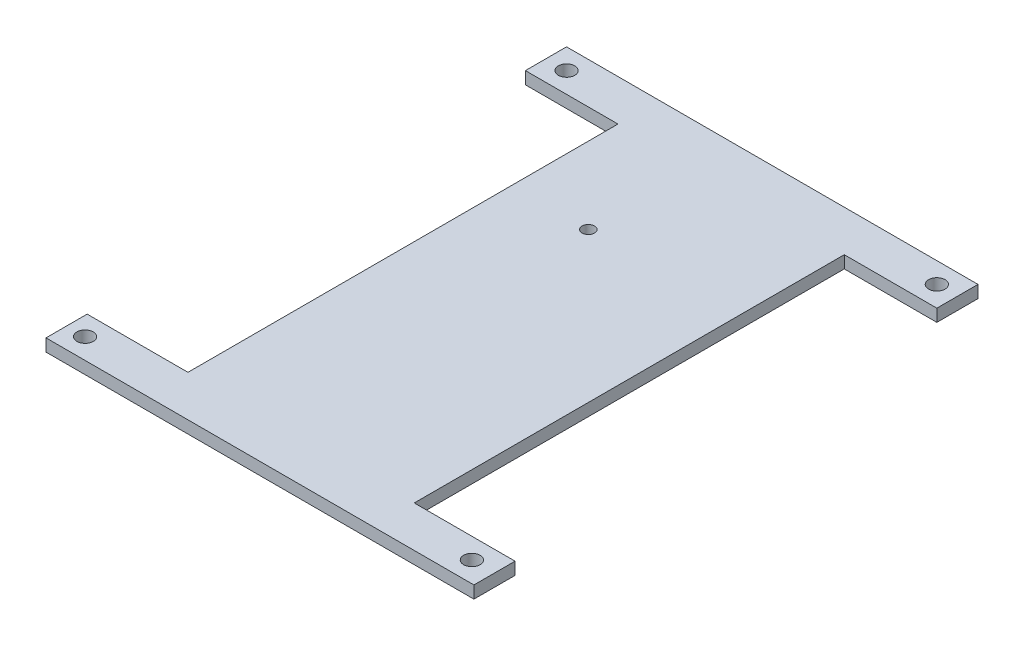
ISO-10303-21;
HEADER;
FILE_DESCRIPTION(('STEP AP214'),'2;1');
FILE_NAME('part.step','',(''),(''),'','','');
FILE_SCHEMA(('AUTOMOTIVE_DESIGN { 1 0 10303 214 1 1 1 1 }'));
ENDSEC;
DATA;
#1=APPLICATION_CONTEXT('core data for automotive mechanical design processes');
#2=APPLICATION_PROTOCOL_DEFINITION('international standard','automotive_design',2000,#1);
#3=PRODUCT_CONTEXT('',#1,'mechanical');
#4=PRODUCT('Part','Part','',(#3));
#5=PRODUCT_RELATED_PRODUCT_CATEGORY('part','',(#4));
#6=PRODUCT_DEFINITION_FORMATION('','',#4);
#7=PRODUCT_DEFINITION_CONTEXT('part definition',#1,'design');
#8=PRODUCT_DEFINITION('design','',#6,#7);
#9=PRODUCT_DEFINITION_SHAPE('','',#8);
#10=(LENGTH_UNIT() NAMED_UNIT(*) SI_UNIT(.MILLI.,.METRE.));
#11=(NAMED_UNIT(*) PLANE_ANGLE_UNIT() SI_UNIT($,.RADIAN.));
#12=(NAMED_UNIT(*) SI_UNIT($,.STERADIAN.) SOLID_ANGLE_UNIT());
#13=UNCERTAINTY_MEASURE_WITH_UNIT(LENGTH_MEASURE(1.E-05),#10,'distance_accuracy_value','');
#14=(GEOMETRIC_REPRESENTATION_CONTEXT(3) GLOBAL_UNCERTAINTY_ASSIGNED_CONTEXT((#13)) GLOBAL_UNIT_ASSIGNED_CONTEXT((#10,
#11,#12)) REPRESENTATION_CONTEXT('',''));
#15=CARTESIAN_POINT('',(0.,0.,0.));
#16=DIRECTION('',(0.,0.,1.));
#17=DIRECTION('',(1.,0.,0.));
#18=AXIS2_PLACEMENT_3D('',#15,#16,#17);
#19=CARTESIAN_POINT('',(0.,0.,0.));
#20=DIRECTION('',(0.,1.,0.));
#21=DIRECTION('',(0.,0.,1.));
#22=AXIS2_PLACEMENT_3D('',#19,#20,#21);
#23=PLANE('',#22);
#24=CARTESIAN_POINT('',(-8.90000000000001,0.,-29.2));
#25=DIRECTION('',(0.,1.,0.));
#26=DIRECTION('',(0.,0.,1.));
#27=AXIS2_PLACEMENT_3D('',#24,#25,#26);
#28=CIRCLE('',#27,1.5);
#29=CARTESIAN_POINT('',(-8.90000000000001,0.,-27.7));
#30=VERTEX_POINT('',#29);
#31=EDGE_CURVE('E198',#30,#30,#28,.T.);
#32=ORIENTED_EDGE('',*,*,#31,.T.);
#33=EDGE_LOOP('',(#32));
#34=FACE_BOUND('',#33,.T.);
#35=DIRECTION('',(0.,0.,-1.));
#36=VECTOR('',#35,1.);
#37=CARTESIAN_POINT('',(-27.5,0.,0.));
#38=LINE('',#37,#36);
#39=CARTESIAN_POINT('',(-27.5,0.,49.51));
#40=VERTEX_POINT('',#39);
#41=CARTESIAN_POINT('',(-27.5,0.,-55.));
#42=VERTEX_POINT('',#41);
#43=EDGE_CURVE('E335',#40,#42,#38,.T.);
#44=ORIENTED_EDGE('',*,*,#43,.T.);
#45=DIRECTION('',(1.,0.,0.));
#46=VECTOR('',#45,1.);
#47=CARTESIAN_POINT('',(-50.,0.,-55.));
#48=LINE('',#47,#46);
#49=CARTESIAN_POINT('',(-50.,0.,-55.));
#50=VERTEX_POINT('',#49);
#51=EDGE_CURVE('E322',#50,#42,#48,.T.);
#52=ORIENTED_EDGE('',*,*,#51,.F.);
#53=DIRECTION('',(0.,0.,1.));
#54=VECTOR('',#53,1.);
#55=CARTESIAN_POINT('',(-50.,0.,-55.));
#56=LINE('',#55,#54);
#57=CARTESIAN_POINT('',(-50.,0.,-65.));
#58=VERTEX_POINT('',#57);
#59=EDGE_CURVE('E295',#58,#50,#56,.T.);
#60=ORIENTED_EDGE('',*,*,#59,.F.);
#61=DIRECTION('',(-1.,0.,0.));
#62=VECTOR('',#61,1.);
#63=CARTESIAN_POINT('',(-50.,0.,-65.));
#64=LINE('',#63,#62);
#65=CARTESIAN_POINT('',(50.,0.,-65.));
#66=VERTEX_POINT('',#65);
#67=EDGE_CURVE('E311',#66,#58,#64,.T.);
#68=ORIENTED_EDGE('',*,*,#67,.F.);
#69=DIRECTION('',(0.,0.,-1.));
#70=VECTOR('',#69,1.);
#71=CARTESIAN_POINT('',(50.,0.,-55.));
#72=LINE('',#71,#70);
#73=CARTESIAN_POINT('',(50.,0.,-55.));
#74=VERTEX_POINT('',#73);
#75=EDGE_CURVE('E319',#74,#66,#72,.T.);
#76=ORIENTED_EDGE('',*,*,#75,.F.);
#77=CARTESIAN_POINT('',(27.5,0.,-55.));
#78=VERTEX_POINT('',#77);
#79=EDGE_CURVE('E297',#78,#74,#48,.T.);
#80=ORIENTED_EDGE('',*,*,#79,.F.);
#81=DIRECTION('',(0.,0.,-1.));
#82=VECTOR('',#81,1.);
#83=CARTESIAN_POINT('',(27.5,0.,0.));
#84=LINE('',#83,#82);
#85=CARTESIAN_POINT('',(27.5,0.,49.51));
#86=VERTEX_POINT('',#85);
#87=EDGE_CURVE('E337',#86,#78,#84,.T.);
#88=ORIENTED_EDGE('',*,*,#87,.F.);
#89=DIRECTION('',(-1.,0.,0.));
#90=VECTOR('',#89,1.);
#91=CARTESIAN_POINT('',(-52.,0.,49.51));
#92=LINE('',#91,#90);
#93=CARTESIAN_POINT('',(52.,0.,49.51));
#94=VERTEX_POINT('',#93);
#95=EDGE_CURVE('E132',#94,#86,#92,.T.);
#96=ORIENTED_EDGE('',*,*,#95,.F.);
#97=DIRECTION('',(0.,0.,-1.));
#98=VECTOR('',#97,1.);
#99=CARTESIAN_POINT('',(52.,0.,59.51));
#100=LINE('',#99,#98);
#101=CARTESIAN_POINT('',(52.,0.,59.51));
#102=VERTEX_POINT('',#101);
#103=EDGE_CURVE('E143',#102,#94,#100,.T.);
#104=ORIENTED_EDGE('',*,*,#103,.F.);
#105=DIRECTION('',(1.,0.,0.));
#106=VECTOR('',#105,1.);
#107=CARTESIAN_POINT('',(-52.,0.,59.51));
#108=LINE('',#107,#106);
#109=CARTESIAN_POINT('',(-52.,0.,59.51));
#110=VERTEX_POINT('',#109);
#111=EDGE_CURVE('E124',#110,#102,#108,.T.);
#112=ORIENTED_EDGE('',*,*,#111,.F.);
#113=DIRECTION('',(0.,0.,1.));
#114=VECTOR('',#113,1.);
#115=CARTESIAN_POINT('',(-52.,0.,59.51));
#116=LINE('',#115,#114);
#117=CARTESIAN_POINT('',(-52.,0.,49.51));
#118=VERTEX_POINT('',#117);
#119=EDGE_CURVE('E140',#118,#110,#116,.T.);
#120=ORIENTED_EDGE('',*,*,#119,.F.);
#121=EDGE_CURVE('E159',#40,#118,#92,.T.);
#122=ORIENTED_EDGE('',*,*,#121,.F.);
#123=EDGE_LOOP('',(#44,#52,#60,#68,#76,#80,#88,#96,#104,#112,#120,#122));
#124=FACE_BOUND('',#123,.T.);
#125=CARTESIAN_POINT('',(45.,0.,-60.));
#126=DIRECTION('',(0.,1.,0.));
#127=DIRECTION('',(0.,0.,1.));
#128=AXIS2_PLACEMENT_3D('',#125,#126,#127);
#129=CIRCLE('',#128,2.);
#130=CARTESIAN_POINT('',(45.,0.,-58.));
#131=VERTEX_POINT('',#130);
#132=EDGE_CURVE('E495',#131,#131,#129,.T.);
#133=ORIENTED_EDGE('',*,*,#132,.T.);
#134=EDGE_LOOP('',(#133));
#135=FACE_BOUND('',#134,.T.);
#136=CARTESIAN_POINT('',(-45.,0.,-60.));
#137=DIRECTION('',(0.,1.,0.));
#138=DIRECTION('',(0.,0.,1.));
#139=AXIS2_PLACEMENT_3D('',#136,#137,#138);
#140=CIRCLE('',#139,2.);
#141=CARTESIAN_POINT('',(-45.,0.,-58.));
#142=VERTEX_POINT('',#141);
#143=EDGE_CURVE('E288',#142,#142,#140,.T.);
#144=ORIENTED_EDGE('',*,*,#143,.T.);
#145=EDGE_LOOP('',(#144));
#146=FACE_BOUND('',#145,.T.);
#147=CARTESIAN_POINT('',(46.5,0.,54.51));
#148=DIRECTION('',(0.,1.,0.));
#149=DIRECTION('',(0.,0.,1.));
#150=AXIS2_PLACEMENT_3D('',#147,#148,#149);
#151=CIRCLE('',#150,2.);
#152=CARTESIAN_POINT('',(46.5,0.,56.51));
#153=VERTEX_POINT('',#152);
#154=EDGE_CURVE('E193',#153,#153,#151,.T.);
#155=ORIENTED_EDGE('',*,*,#154,.T.);
#156=EDGE_LOOP('',(#155));
#157=FACE_BOUND('',#156,.T.);
#158=CARTESIAN_POINT('',(-47.5,0.,54.51));
#159=DIRECTION('',(0.,1.,0.));
#160=DIRECTION('',(0.,0.,1.));
#161=AXIS2_PLACEMENT_3D('',#158,#159,#160);
#162=CIRCLE('',#161,2.);
#163=CARTESIAN_POINT('',(-47.5,0.,56.51));
#164=VERTEX_POINT('',#163);
#165=EDGE_CURVE('E188',#164,#164,#162,.T.);
#166=ORIENTED_EDGE('',*,*,#165,.T.);
#167=EDGE_LOOP('',(#166));
#168=FACE_BOUND('',#167,.T.);
#169=ADVANCED_FACE('F32',(#34,#124,#135,#146,#157,#168),#23,.F.);
#170=CARTESIAN_POINT('',(-27.5,0.,0.));
#171=DIRECTION('',(1.,0.,0.));
#172=DIRECTION('',(0.,0.,-1.));
#173=AXIS2_PLACEMENT_3D('',#170,#171,#172);
#174=PLANE('',#173);
#175=DIRECTION('',(0.,0.,-1.));
#176=VECTOR('',#175,1.);
#177=CARTESIAN_POINT('',(-27.5,3.,0.));
#178=LINE('',#177,#176);
#179=CARTESIAN_POINT('',(-27.5,3.,49.51));
#180=VERTEX_POINT('',#179);
#181=CARTESIAN_POINT('',(-27.5,3.,-55.));
#182=VERTEX_POINT('',#181);
#183=EDGE_CURVE('E340',#180,#182,#178,.T.);
#184=ORIENTED_EDGE('',*,*,#183,.T.);
#185=DIRECTION('',(0.,1.,0.));
#186=VECTOR('',#185,1.);
#187=CARTESIAN_POINT('',(-27.5,0.,-55.));
#188=LINE('',#187,#186);
#189=EDGE_CURVE('E11',#42,#182,#188,.T.);
#190=ORIENTED_EDGE('',*,*,#189,.F.);
#191=ORIENTED_EDGE('',*,*,#43,.F.);
#192=DIRECTION('',(0.,1.,0.));
#193=VECTOR('',#192,1.);
#194=CARTESIAN_POINT('',(-27.5,0.,49.51));
#195=LINE('',#194,#193);
#196=EDGE_CURVE('E35',#40,#180,#195,.T.);
#197=ORIENTED_EDGE('',*,*,#196,.T.);
#198=EDGE_LOOP('',(#184,#190,#191,#197));
#199=FACE_BOUND('',#198,.T.);
#200=ADVANCED_FACE('F221',(#199),#174,.F.);
#201=CARTESIAN_POINT('',(27.5,0.,0.));
#202=DIRECTION('',(1.,0.,0.));
#203=DIRECTION('',(0.,0.,-1.));
#204=AXIS2_PLACEMENT_3D('',#201,#202,#203);
#205=PLANE('',#204);
#206=DIRECTION('',(0.,0.,-1.));
#207=VECTOR('',#206,1.);
#208=CARTESIAN_POINT('',(27.5,3.,0.));
#209=LINE('',#208,#207);
#210=CARTESIAN_POINT('',(27.5,3.,49.51));
#211=VERTEX_POINT('',#210);
#212=CARTESIAN_POINT('',(27.5,3.,-55.));
#213=VERTEX_POINT('',#212);
#214=EDGE_CURVE('E304',#211,#213,#209,.T.);
#215=ORIENTED_EDGE('',*,*,#214,.F.);
#216=DIRECTION('',(0.,1.,0.));
#217=VECTOR('',#216,1.);
#218=CARTESIAN_POINT('',(27.5,0.,49.51));
#219=LINE('',#218,#217);
#220=EDGE_CURVE('E53',#86,#211,#219,.T.);
#221=ORIENTED_EDGE('',*,*,#220,.F.);
#222=ORIENTED_EDGE('',*,*,#87,.T.);
#223=DIRECTION('',(0.,1.,0.));
#224=VECTOR('',#223,1.);
#225=CARTESIAN_POINT('',(27.5,0.,-55.));
#226=LINE('',#225,#224);
#227=EDGE_CURVE('E48',#78,#213,#226,.T.);
#228=ORIENTED_EDGE('',*,*,#227,.T.);
#229=EDGE_LOOP('',(#215,#221,#222,#228));
#230=FACE_BOUND('',#229,.T.);
#231=ADVANCED_FACE('F212',(#230),#205,.T.);
#232=CARTESIAN_POINT('',(0.,3.,0.));
#233=DIRECTION('',(0.,1.,0.));
#234=DIRECTION('',(0.,0.,1.));
#235=AXIS2_PLACEMENT_3D('',#232,#233,#234);
#236=PLANE('',#235);
#237=CARTESIAN_POINT('',(-8.90000000000001,3.,-29.2));
#238=DIRECTION('',(0.,1.,0.));
#239=DIRECTION('',(0.,0.,1.));
#240=AXIS2_PLACEMENT_3D('',#237,#238,#239);
#241=CIRCLE('',#240,1.5);
#242=CARTESIAN_POINT('',(-8.90000000000001,3.,-27.7));
#243=VERTEX_POINT('',#242);
#244=EDGE_CURVE('E203',#243,#243,#241,.T.);
#245=ORIENTED_EDGE('',*,*,#244,.F.);
#246=EDGE_LOOP('',(#245));
#247=FACE_BOUND('',#246,.T.);
#248=ORIENTED_EDGE('',*,*,#214,.T.);
#249=DIRECTION('',(1.,0.,0.));
#250=VECTOR('',#249,1.);
#251=CARTESIAN_POINT('',(-50.,3.,-55.));
#252=LINE('',#251,#250);
#253=CARTESIAN_POINT('',(50.,3.,-55.));
#254=VERTEX_POINT('',#253);
#255=EDGE_CURVE('E287',#213,#254,#252,.T.);
#256=ORIENTED_EDGE('',*,*,#255,.T.);
#257=DIRECTION('',(0.,0.,-1.));
#258=VECTOR('',#257,1.);
#259=CARTESIAN_POINT('',(50.,3.,-55.));
#260=LINE('',#259,#258);
#261=CARTESIAN_POINT('',(50.,3.,-65.));
#262=VERTEX_POINT('',#261);
#263=EDGE_CURVE('E294',#254,#262,#260,.T.);
#264=ORIENTED_EDGE('',*,*,#263,.T.);
#265=DIRECTION('',(-1.,0.,0.));
#266=VECTOR('',#265,1.);
#267=CARTESIAN_POINT('',(-50.,3.,-65.));
#268=LINE('',#267,#266);
#269=CARTESIAN_POINT('',(-50.,3.,-65.));
#270=VERTEX_POINT('',#269);
#271=EDGE_CURVE('E292',#262,#270,#268,.T.);
#272=ORIENTED_EDGE('',*,*,#271,.T.);
#273=DIRECTION('',(0.,0.,1.));
#274=VECTOR('',#273,1.);
#275=CARTESIAN_POINT('',(-50.,3.,-55.));
#276=LINE('',#275,#274);
#277=CARTESIAN_POINT('',(-50.,3.,-55.));
#278=VERTEX_POINT('',#277);
#279=EDGE_CURVE('E279',#270,#278,#276,.T.);
#280=ORIENTED_EDGE('',*,*,#279,.T.);
#281=EDGE_CURVE('E299',#278,#182,#252,.T.);
#282=ORIENTED_EDGE('',*,*,#281,.T.);
#283=ORIENTED_EDGE('',*,*,#183,.F.);
#284=DIRECTION('',(-1.,0.,0.));
#285=VECTOR('',#284,1.);
#286=CARTESIAN_POINT('',(-52.,3.,49.51));
#287=LINE('',#286,#285);
#288=CARTESIAN_POINT('',(-52.,3.,49.51));
#289=VERTEX_POINT('',#288);
#290=EDGE_CURVE('E152',#180,#289,#287,.T.);
#291=ORIENTED_EDGE('',*,*,#290,.T.);
#292=DIRECTION('',(0.,0.,1.));
#293=VECTOR('',#292,1.);
#294=CARTESIAN_POINT('',(-52.,3.,59.51));
#295=LINE('',#294,#293);
#296=CARTESIAN_POINT('',(-52.,3.,59.51));
#297=VERTEX_POINT('',#296);
#298=EDGE_CURVE('E162',#289,#297,#295,.T.);
#299=ORIENTED_EDGE('',*,*,#298,.T.);
#300=DIRECTION('',(1.,0.,0.));
#301=VECTOR('',#300,1.);
#302=CARTESIAN_POINT('',(-52.,3.,59.51));
#303=LINE('',#302,#301);
#304=CARTESIAN_POINT('',(52.,3.,59.51));
#305=VERTEX_POINT('',#304);
#306=EDGE_CURVE('E126',#297,#305,#303,.T.);
#307=ORIENTED_EDGE('',*,*,#306,.T.);
#308=DIRECTION('',(0.,0.,-1.));
#309=VECTOR('',#308,1.);
#310=CARTESIAN_POINT('',(52.,3.,59.51));
#311=LINE('',#310,#309);
#312=CARTESIAN_POINT('',(52.,3.,49.51));
#313=VERTEX_POINT('',#312);
#314=EDGE_CURVE('E171',#305,#313,#311,.T.);
#315=ORIENTED_EDGE('',*,*,#314,.T.);
#316=EDGE_CURVE('E149',#313,#211,#287,.T.);
#317=ORIENTED_EDGE('',*,*,#316,.T.);
#318=EDGE_LOOP('',(#248,#256,#264,#272,#280,#282,#283,#291,#299,#307,#315,#317));
#319=FACE_BOUND('',#318,.T.);
#320=CARTESIAN_POINT('',(45.,3.,-60.));
#321=DIRECTION('',(0.,1.,0.));
#322=DIRECTION('',(0.,0.,1.));
#323=AXIS2_PLACEMENT_3D('',#320,#321,#322);
#324=CIRCLE('',#323,2.);
#325=CARTESIAN_POINT('',(45.,3.,-58.));
#326=VERTEX_POINT('',#325);
#327=EDGE_CURVE('E177',#326,#326,#324,.T.);
#328=ORIENTED_EDGE('',*,*,#327,.F.);
#329=EDGE_LOOP('',(#328));
#330=FACE_BOUND('',#329,.T.);
#331=CARTESIAN_POINT('',(-45.,3.,-60.));
#332=DIRECTION('',(0.,1.,0.));
#333=DIRECTION('',(0.,0.,1.));
#334=AXIS2_PLACEMENT_3D('',#331,#332,#333);
#335=CIRCLE('',#334,2.);
#336=CARTESIAN_POINT('',(-45.,3.,-58.));
#337=VERTEX_POINT('',#336);
#338=EDGE_CURVE('E492',#337,#337,#335,.T.);
#339=ORIENTED_EDGE('',*,*,#338,.F.);
#340=EDGE_LOOP('',(#339));
#341=FACE_BOUND('',#340,.T.);
#342=CARTESIAN_POINT('',(46.5,3.,54.51));
#343=DIRECTION('',(0.,1.,0.));
#344=DIRECTION('',(0.,0.,1.));
#345=AXIS2_PLACEMENT_3D('',#342,#343,#344);
#346=CIRCLE('',#345,2.);
#347=CARTESIAN_POINT('',(46.5,3.,56.51));
#348=VERTEX_POINT('',#347);
#349=EDGE_CURVE('E195',#348,#348,#346,.T.);
#350=ORIENTED_EDGE('',*,*,#349,.F.);
#351=EDGE_LOOP('',(#350));
#352=FACE_BOUND('',#351,.T.);
#353=CARTESIAN_POINT('',(-47.5,3.,54.51));
#354=DIRECTION('',(0.,1.,0.));
#355=DIRECTION('',(0.,0.,1.));
#356=AXIS2_PLACEMENT_3D('',#353,#354,#355);
#357=CIRCLE('',#356,2.);
#358=CARTESIAN_POINT('',(-47.5,3.,56.51));
#359=VERTEX_POINT('',#358);
#360=EDGE_CURVE('E155',#359,#359,#357,.T.);
#361=ORIENTED_EDGE('',*,*,#360,.F.);
#362=EDGE_LOOP('',(#361));
#363=FACE_BOUND('',#362,.T.);
#364=ADVANCED_FACE('F186',(#247,#319,#330,#341,#352,#363),#236,.T.);
#365=CARTESIAN_POINT('',(-50.,0.,-55.));
#366=DIRECTION('',(0.,0.,1.));
#367=DIRECTION('',(1.,0.,0.));
#368=AXIS2_PLACEMENT_3D('',#365,#366,#367);
#369=PLANE('',#368);
#370=ORIENTED_EDGE('',*,*,#227,.F.);
#371=ORIENTED_EDGE('',*,*,#79,.T.);
#372=DIRECTION('',(0.,1.,0.));
#373=VECTOR('',#372,1.);
#374=CARTESIAN_POINT('',(50.,0.,-55.));
#375=LINE('',#374,#373);
#376=EDGE_CURVE('E307',#74,#254,#375,.T.);
#377=ORIENTED_EDGE('',*,*,#376,.T.);
#378=ORIENTED_EDGE('',*,*,#255,.F.);
#379=EDGE_LOOP('',(#370,#371,#377,#378));
#380=FACE_BOUND('',#379,.T.);
#381=ADVANCED_FACE('F211',(#380),#369,.T.);
#382=CARTESIAN_POINT('',(-50.,0.,-55.));
#383=DIRECTION('',(-1.,0.,0.));
#384=DIRECTION('',(0.,0.,1.));
#385=AXIS2_PLACEMENT_3D('',#382,#383,#384);
#386=PLANE('',#385);
#387=ORIENTED_EDGE('',*,*,#279,.F.);
#388=DIRECTION('',(0.,1.,0.));
#389=VECTOR('',#388,1.);
#390=CARTESIAN_POINT('',(-50.,0.,-65.));
#391=LINE('',#390,#389);
#392=EDGE_CURVE('E282',#58,#270,#391,.T.);
#393=ORIENTED_EDGE('',*,*,#392,.F.);
#394=ORIENTED_EDGE('',*,*,#59,.T.);
#395=DIRECTION('',(0.,1.,0.));
#396=VECTOR('',#395,1.);
#397=CARTESIAN_POINT('',(-50.,0.,-55.));
#398=LINE('',#397,#396);
#399=EDGE_CURVE('E284',#50,#278,#398,.T.);
#400=ORIENTED_EDGE('',*,*,#399,.T.);
#401=EDGE_LOOP('',(#387,#393,#394,#400));
#402=FACE_BOUND('',#401,.T.);
#403=ADVANCED_FACE('F217',(#402),#386,.T.);
#404=CARTESIAN_POINT('',(-50.,0.,-65.));
#405=DIRECTION('',(0.,0.,-1.));
#406=DIRECTION('',(-1.,0.,0.));
#407=AXIS2_PLACEMENT_3D('',#404,#405,#406);
#408=PLANE('',#407);
#409=ORIENTED_EDGE('',*,*,#271,.F.);
#410=DIRECTION('',(0.,1.,0.));
#411=VECTOR('',#410,1.);
#412=CARTESIAN_POINT('',(50.,0.,-65.));
#413=LINE('',#412,#411);
#414=EDGE_CURVE('E305',#66,#262,#413,.T.);
#415=ORIENTED_EDGE('',*,*,#414,.F.);
#416=ORIENTED_EDGE('',*,*,#67,.T.);
#417=ORIENTED_EDGE('',*,*,#392,.T.);
#418=EDGE_LOOP('',(#409,#415,#416,#417));
#419=FACE_BOUND('',#418,.T.);
#420=ADVANCED_FACE('F263',(#419),#408,.T.);
#421=CARTESIAN_POINT('',(50.,0.,-55.));
#422=DIRECTION('',(1.,0.,0.));
#423=DIRECTION('',(0.,0.,-1.));
#424=AXIS2_PLACEMENT_3D('',#421,#422,#423);
#425=PLANE('',#424);
#426=ORIENTED_EDGE('',*,*,#263,.F.);
#427=ORIENTED_EDGE('',*,*,#376,.F.);
#428=ORIENTED_EDGE('',*,*,#75,.T.);
#429=ORIENTED_EDGE('',*,*,#414,.T.);
#430=EDGE_LOOP('',(#426,#427,#428,#429));
#431=FACE_BOUND('',#430,.T.);
#432=ADVANCED_FACE('F266',(#431),#425,.T.);
#433=ORIENTED_EDGE('',*,*,#51,.T.);
#434=ORIENTED_EDGE('',*,*,#189,.T.);
#435=ORIENTED_EDGE('',*,*,#281,.F.);
#436=ORIENTED_EDGE('',*,*,#399,.F.);
#437=EDGE_LOOP('',(#433,#434,#435,#436));
#438=FACE_BOUND('',#437,.T.);
#439=ADVANCED_FACE('F220',(#438),#369,.T.);
#440=CARTESIAN_POINT('',(-45.,0.,-60.));
#441=DIRECTION('',(0.,1.,0.));
#442=DIRECTION('',(0.,0.,1.));
#443=AXIS2_PLACEMENT_3D('',#440,#441,#442);
#444=CYLINDRICAL_SURFACE('',#443,2.);
#445=ORIENTED_EDGE('',*,*,#143,.F.);
#446=EDGE_LOOP('',(#445));
#447=FACE_BOUND('',#446,.T.);
#448=ORIENTED_EDGE('',*,*,#338,.T.);
#449=EDGE_LOOP('',(#448));
#450=FACE_BOUND('',#449,.T.);
#451=ADVANCED_FACE('F258',(#447,#450),#444,.F.);
#452=CARTESIAN_POINT('',(45.,0.,-60.));
#453=DIRECTION('',(0.,1.,0.));
#454=DIRECTION('',(0.,0.,1.));
#455=AXIS2_PLACEMENT_3D('',#452,#453,#454);
#456=CYLINDRICAL_SURFACE('',#455,2.);
#457=ORIENTED_EDGE('',*,*,#132,.F.);
#458=EDGE_LOOP('',(#457));
#459=FACE_BOUND('',#458,.T.);
#460=ORIENTED_EDGE('',*,*,#327,.T.);
#461=EDGE_LOOP('',(#460));
#462=FACE_BOUND('',#461,.T.);
#463=ADVANCED_FACE('F255',(#459,#462),#456,.F.);
#464=CARTESIAN_POINT('',(-52.,0.,49.51));
#465=DIRECTION('',(0.,0.,-1.));
#466=DIRECTION('',(-1.,0.,0.));
#467=AXIS2_PLACEMENT_3D('',#464,#465,#466);
#468=PLANE('',#467);
#469=ORIENTED_EDGE('',*,*,#196,.F.);
#470=ORIENTED_EDGE('',*,*,#121,.T.);
#471=DIRECTION('',(0.,1.,0.));
#472=VECTOR('',#471,1.);
#473=CARTESIAN_POINT('',(-52.,0.,49.51));
#474=LINE('',#473,#472);
#475=EDGE_CURVE('E148',#118,#289,#474,.T.);
#476=ORIENTED_EDGE('',*,*,#475,.T.);
#477=ORIENTED_EDGE('',*,*,#290,.F.);
#478=EDGE_LOOP('',(#469,#470,#476,#477));
#479=FACE_BOUND('',#478,.T.);
#480=ADVANCED_FACE('F248',(#479),#468,.T.);
#481=CARTESIAN_POINT('',(-52.,0.,59.51));
#482=DIRECTION('',(-1.,0.,0.));
#483=DIRECTION('',(0.,0.,1.));
#484=AXIS2_PLACEMENT_3D('',#481,#482,#483);
#485=PLANE('',#484);
#486=ORIENTED_EDGE('',*,*,#298,.F.);
#487=ORIENTED_EDGE('',*,*,#475,.F.);
#488=ORIENTED_EDGE('',*,*,#119,.T.);
#489=DIRECTION('',(0.,1.,0.));
#490=VECTOR('',#489,1.);
#491=CARTESIAN_POINT('',(-52.,0.,59.51));
#492=LINE('',#491,#490);
#493=EDGE_CURVE('E121',#110,#297,#492,.T.);
#494=ORIENTED_EDGE('',*,*,#493,.T.);
#495=EDGE_LOOP('',(#486,#487,#488,#494));
#496=FACE_BOUND('',#495,.T.);
#497=ADVANCED_FACE('F146',(#496),#485,.T.);
#498=ORIENTED_EDGE('',*,*,#95,.T.);
#499=ORIENTED_EDGE('',*,*,#220,.T.);
#500=ORIENTED_EDGE('',*,*,#316,.F.);
#501=DIRECTION('',(0.,1.,0.));
#502=VECTOR('',#501,1.);
#503=CARTESIAN_POINT('',(52.,0.,49.51));
#504=LINE('',#503,#502);
#505=EDGE_CURVE('E178',#94,#313,#504,.T.);
#506=ORIENTED_EDGE('',*,*,#505,.F.);
#507=EDGE_LOOP('',(#498,#499,#500,#506));
#508=FACE_BOUND('',#507,.T.);
#509=ADVANCED_FACE('F244',(#508),#468,.T.);
#510=CARTESIAN_POINT('',(52.,0.,59.51));
#511=DIRECTION('',(1.,0.,0.));
#512=DIRECTION('',(0.,0.,-1.));
#513=AXIS2_PLACEMENT_3D('',#510,#511,#512);
#514=PLANE('',#513);
#515=ORIENTED_EDGE('',*,*,#314,.F.);
#516=DIRECTION('',(0.,1.,0.));
#517=VECTOR('',#516,1.);
#518=CARTESIAN_POINT('',(52.,0.,59.51));
#519=LINE('',#518,#517);
#520=EDGE_CURVE('E131',#102,#305,#519,.T.);
#521=ORIENTED_EDGE('',*,*,#520,.F.);
#522=ORIENTED_EDGE('',*,*,#103,.T.);
#523=ORIENTED_EDGE('',*,*,#505,.T.);
#524=EDGE_LOOP('',(#515,#521,#522,#523));
#525=FACE_BOUND('',#524,.T.);
#526=ADVANCED_FACE('F183',(#525),#514,.T.);
#527=CARTESIAN_POINT('',(-52.,0.,59.51));
#528=DIRECTION('',(0.,0.,1.));
#529=DIRECTION('',(1.,0.,0.));
#530=AXIS2_PLACEMENT_3D('',#527,#528,#529);
#531=PLANE('',#530);
#532=ORIENTED_EDGE('',*,*,#306,.F.);
#533=ORIENTED_EDGE('',*,*,#493,.F.);
#534=ORIENTED_EDGE('',*,*,#111,.T.);
#535=ORIENTED_EDGE('',*,*,#520,.T.);
#536=EDGE_LOOP('',(#532,#533,#534,#535));
#537=FACE_BOUND('',#536,.T.);
#538=ADVANCED_FACE('F123',(#537),#531,.T.);
#539=CARTESIAN_POINT('',(-47.5,0.,54.51));
#540=DIRECTION('',(0.,1.,0.));
#541=DIRECTION('',(0.,0.,1.));
#542=AXIS2_PLACEMENT_3D('',#539,#540,#541);
#543=CYLINDRICAL_SURFACE('',#542,2.);
#544=ORIENTED_EDGE('',*,*,#165,.F.);
#545=EDGE_LOOP('',(#544));
#546=FACE_BOUND('',#545,.T.);
#547=ORIENTED_EDGE('',*,*,#360,.T.);
#548=EDGE_LOOP('',(#547));
#549=FACE_BOUND('',#548,.T.);
#550=ADVANCED_FACE('F237',(#546,#549),#543,.F.);
#551=CARTESIAN_POINT('',(46.5,0.,54.51));
#552=DIRECTION('',(0.,1.,0.));
#553=DIRECTION('',(0.,0.,1.));
#554=AXIS2_PLACEMENT_3D('',#551,#552,#553);
#555=CYLINDRICAL_SURFACE('',#554,2.);
#556=ORIENTED_EDGE('',*,*,#154,.F.);
#557=EDGE_LOOP('',(#556));
#558=FACE_BOUND('',#557,.T.);
#559=ORIENTED_EDGE('',*,*,#349,.T.);
#560=EDGE_LOOP('',(#559));
#561=FACE_BOUND('',#560,.T.);
#562=ADVANCED_FACE('F232',(#558,#561),#555,.F.);
#563=CARTESIAN_POINT('',(-8.90000000000001,-5.00000000001367E-05,-29.2));
#564=DIRECTION('',(0.,1.,0.));
#565=DIRECTION('',(0.,0.,1.));
#566=AXIS2_PLACEMENT_3D('',#563,#564,#565);
#567=CYLINDRICAL_SURFACE('',#566,1.5);
#568=CARTESIAN_POINT('',(-8.90000000000001,3.,-27.7));
#569=CARTESIAN_POINT('',(-8.90000000000001,2.96875,-27.7));
#570=CARTESIAN_POINT('',(-8.90000000000001,2.9375,-27.7));
#571=CARTESIAN_POINT('',(-8.90000000000001,2.875,-27.7));
#572=CARTESIAN_POINT('',(-8.90000000000001,2.84375,-27.7));
#573=CARTESIAN_POINT('',(-8.90000000000001,2.78125,-27.7));
#574=CARTESIAN_POINT('',(-8.90000000000001,2.75,-27.7));
#575=CARTESIAN_POINT('',(-8.90000000000001,2.6875,-27.7));
#576=CARTESIAN_POINT('',(-8.90000000000001,2.65625,-27.7));
#577=CARTESIAN_POINT('',(-8.90000000000001,2.59375,-27.7));
#578=CARTESIAN_POINT('',(-8.90000000000001,2.5625,-27.7));
#579=CARTESIAN_POINT('',(-8.90000000000001,2.5,-27.7));
#580=CARTESIAN_POINT('',(-8.90000000000001,2.46875,-27.7));
#581=CARTESIAN_POINT('',(-8.90000000000001,2.40625,-27.7));
#582=CARTESIAN_POINT('',(-8.90000000000001,2.375,-27.7));
#583=CARTESIAN_POINT('',(-8.90000000000001,2.3125,-27.7));
#584=CARTESIAN_POINT('',(-8.90000000000001,2.28125,-27.7));
#585=CARTESIAN_POINT('',(-8.90000000000001,2.21875,-27.7));
#586=CARTESIAN_POINT('',(-8.90000000000001,2.1875,-27.7));
#587=CARTESIAN_POINT('',(-8.90000000000001,2.125,-27.7));
#588=CARTESIAN_POINT('',(-8.90000000000001,2.09375,-27.7));
#589=CARTESIAN_POINT('',(-8.90000000000001,2.03125,-27.7));
#590=CARTESIAN_POINT('',(-8.90000000000001,2.,-27.7));
#591=CARTESIAN_POINT('',(-8.90000000000001,1.9375,-27.7));
#592=CARTESIAN_POINT('',(-8.90000000000001,1.90625,-27.7));
#593=CARTESIAN_POINT('',(-8.90000000000001,1.84375,-27.7));
#594=CARTESIAN_POINT('',(-8.90000000000001,1.8125,-27.7));
#595=CARTESIAN_POINT('',(-8.90000000000001,1.75,-27.7));
#596=CARTESIAN_POINT('',(-8.90000000000001,1.71875,-27.7));
#597=CARTESIAN_POINT('',(-8.90000000000001,1.65625,-27.7));
#598=CARTESIAN_POINT('',(-8.90000000000001,1.625,-27.7));
#599=CARTESIAN_POINT('',(-8.90000000000001,1.5625,-27.7));
#600=CARTESIAN_POINT('',(-8.90000000000001,1.53125,-27.7));
#601=CARTESIAN_POINT('',(-8.90000000000001,1.46875,-27.7));
#602=CARTESIAN_POINT('',(-8.90000000000001,1.4375,-27.7));
#603=CARTESIAN_POINT('',(-8.90000000000001,1.375,-27.7));
#604=CARTESIAN_POINT('',(-8.90000000000001,1.34375,-27.7));
#605=CARTESIAN_POINT('',(-8.90000000000001,1.28125,-27.7));
#606=CARTESIAN_POINT('',(-8.90000000000001,1.25,-27.7));
#607=CARTESIAN_POINT('',(-8.90000000000001,1.1875,-27.7));
#608=CARTESIAN_POINT('',(-8.90000000000001,1.15625,-27.7));
#609=CARTESIAN_POINT('',(-8.90000000000001,1.09375,-27.7));
#610=CARTESIAN_POINT('',(-8.90000000000001,1.0625,-27.7));
#611=CARTESIAN_POINT('',(-8.90000000000001,1.,-27.7));
#612=CARTESIAN_POINT('',(-8.90000000000001,0.96875,-27.7));
#613=CARTESIAN_POINT('',(-8.90000000000001,0.90625,-27.7));
#614=CARTESIAN_POINT('',(-8.90000000000001,0.875,-27.7));
#615=CARTESIAN_POINT('',(-8.90000000000001,0.8125,-27.7));
#616=CARTESIAN_POINT('',(-8.90000000000001,0.78125,-27.7));
#617=CARTESIAN_POINT('',(-8.90000000000001,0.71875,-27.7));
#618=CARTESIAN_POINT('',(-8.90000000000001,0.6875,-27.7));
#619=CARTESIAN_POINT('',(-8.90000000000001,0.625,-27.7));
#620=CARTESIAN_POINT('',(-8.90000000000001,0.59375,-27.7));
#621=CARTESIAN_POINT('',(-8.90000000000001,0.53125,-27.7));
#622=CARTESIAN_POINT('',(-8.90000000000001,0.5,-27.7));
#623=CARTESIAN_POINT('',(-8.90000000000001,0.4375,-27.7));
#624=CARTESIAN_POINT('',(-8.90000000000001,0.40625,-27.7));
#625=CARTESIAN_POINT('',(-8.90000000000001,0.34375,-27.7));
#626=CARTESIAN_POINT('',(-8.90000000000001,0.3125,-27.7));
#627=CARTESIAN_POINT('',(-8.90000000000001,0.25,-27.7));
#628=CARTESIAN_POINT('',(-8.90000000000001,0.21875,-27.7));
#629=CARTESIAN_POINT('',(-8.90000000000001,0.15625,-27.7));
#630=CARTESIAN_POINT('',(-8.90000000000001,0.125,-27.7));
#631=CARTESIAN_POINT('',(-8.90000000000001,0.0625000000000001,-27.7));
#632=CARTESIAN_POINT('',(-8.90000000000001,0.03125,-27.7));
#633=CARTESIAN_POINT('',(-8.90000000000001,0.,-27.7));
#634=B_SPLINE_CURVE_WITH_KNOTS('',3,(#568,#569,#570,#571,#572,#573,#574,#575,#576,#577,#578,
#579,#580,#581,#582,#583,#584,#585,#586,#587,#588,#589,#590,#591,#592,#593,#594,#595,#596,#597,
#598,#599,#600,#601,#602,#603,#604,#605,#606,#607,#608,#609,#610,#611,#612,#613,#614,#615,#616,
#617,#618,#619,#620,#621,#622,#623,#624,#625,#626,#627,#628,#629,#630,#631,#632,#633),
.UNSPECIFIED.,.F.,.F.,(4,2,2,2,2,2,2,2,2,2,2,2,2,2,2,2,2,2,2,2,2,2,2,2,2,2,2,2,2,2,2,2,4),(0.,
0.0937500000000001,0.1875,0.28125,0.375,0.46875,0.5625,0.65625,0.75,0.84375,0.9375,1.03125,
1.125,1.21875,1.3125,1.40625,1.5,1.59375,1.6875,1.78125,1.875,1.96875,2.0625,2.15625,2.25,
2.34375,2.4375,2.53125,2.625,2.71875,2.8125,2.90625,3.),.UNSPECIFIED.);
#635=EDGE_CURVE('BSEAM207',#243,#30,#634,.T.);
#636=ORIENTED_EDGE('',*,*,#244,.T.);
#637=ORIENTED_EDGE('',*,*,#31,.F.);
#638=ORIENTED_EDGE('',*,*,#635,.T.);
#639=ORIENTED_EDGE('',*,*,#635,.F.);
#640=EDGE_LOOP('',(#636,#638,#637,#639));
#641=FACE_BOUND('',#640,.T.);
#642=ADVANCED_FACE('F207',(#641),#567,.F.);
#643=CLOSED_SHELL('',(#169,#200,#231,#364,#381,#403,#420,#432,#439,#451,#463,#480,#497,#509,
#526,#538,#550,#562,#642));
#644=MANIFOLD_SOLID_BREP('B2',#643);
#645=ADVANCED_BREP_SHAPE_REPRESENTATION('',(#18,#644),#14);
#646=SHAPE_DEFINITION_REPRESENTATION(#9,#645);
ENDSEC;
END-ISO-10303-21;
